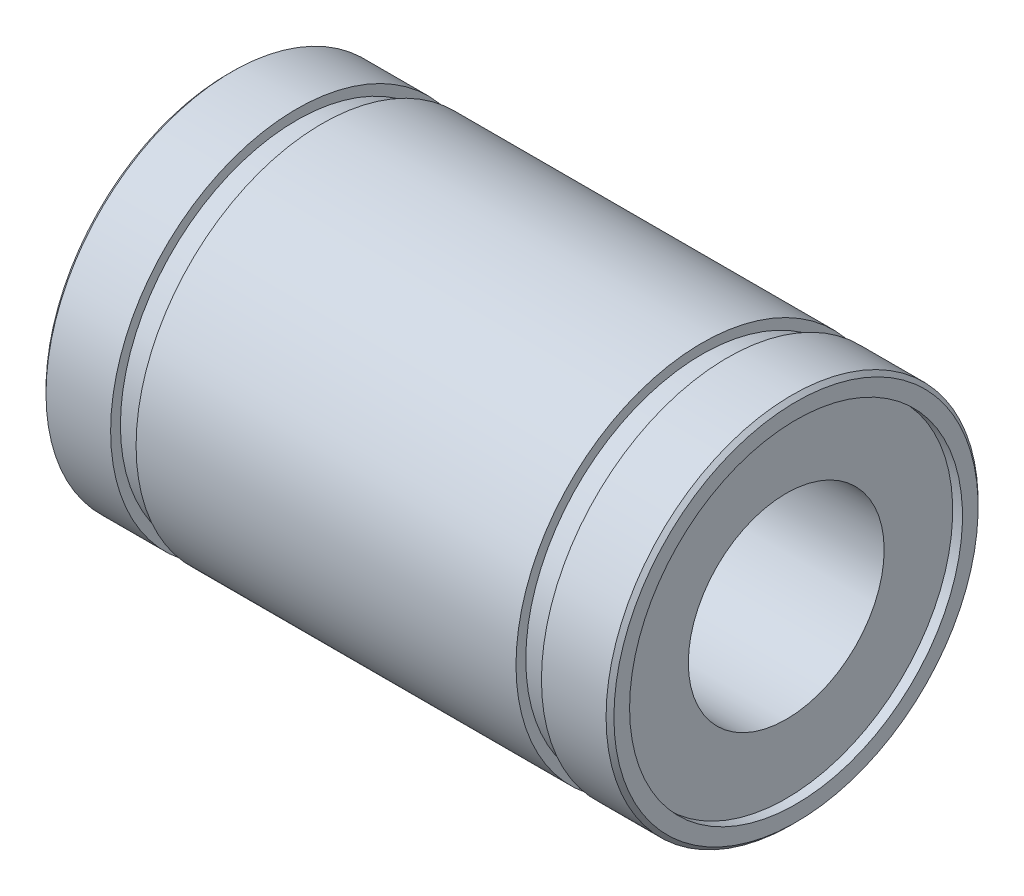
ISO-10303-21;
HEADER;
FILE_DESCRIPTION(('STEP AP214'),'2;1');
FILE_NAME('part.step','',(''),(''),'','','');
FILE_SCHEMA(('AUTOMOTIVE_DESIGN { 1 0 10303 214 1 1 1 1 }'));
ENDSEC;
DATA;
#1=APPLICATION_CONTEXT('core data for automotive mechanical design processes');
#2=APPLICATION_PROTOCOL_DEFINITION('international standard','automotive_design',2000,#1);
#3=PRODUCT_CONTEXT('',#1,'mechanical');
#4=PRODUCT('Part','Part','',(#3));
#5=PRODUCT_RELATED_PRODUCT_CATEGORY('part','',(#4));
#6=PRODUCT_DEFINITION_FORMATION('','',#4);
#7=PRODUCT_DEFINITION_CONTEXT('part definition',#1,'design');
#8=PRODUCT_DEFINITION('design','',#6,#7);
#9=PRODUCT_DEFINITION_SHAPE('','',#8);
#10=(LENGTH_UNIT() NAMED_UNIT(*) SI_UNIT(.MILLI.,.METRE.));
#11=(NAMED_UNIT(*) PLANE_ANGLE_UNIT() SI_UNIT($,.RADIAN.));
#12=(NAMED_UNIT(*) SI_UNIT($,.STERADIAN.) SOLID_ANGLE_UNIT());
#13=UNCERTAINTY_MEASURE_WITH_UNIT(LENGTH_MEASURE(1.E-05),#10,'distance_accuracy_value','');
#14=(GEOMETRIC_REPRESENTATION_CONTEXT(3) GLOBAL_UNCERTAINTY_ASSIGNED_CONTEXT((#13)) GLOBAL_UNIT_ASSIGNED_CONTEXT((#10,
#11,#12)) REPRESENTATION_CONTEXT('',''));
#15=CARTESIAN_POINT('',(0.,0.,0.));
#16=DIRECTION('',(0.,0.,1.));
#17=DIRECTION('',(1.,0.,0.));
#18=AXIS2_PLACEMENT_3D('',#15,#16,#17);
#19=CARTESIAN_POINT('',(0.,0.,0.));
#20=DIRECTION('',(-1.,0.,0.));
#21=DIRECTION('',(0.,0.,1.));
#22=AXIS2_PLACEMENT_3D('',#19,#20,#21);
#23=CYLINDRICAL_SURFACE('',#22,5.);
#24=CARTESIAN_POINT('',(28.5,0.,0.));
#25=DIRECTION('',(-1.,0.,0.));
#26=DIRECTION('',(0.,0.,1.));
#27=AXIS2_PLACEMENT_3D('',#24,#25,#26);
#28=CIRCLE('',#27,5.);
#29=CARTESIAN_POINT('',(28.5,0.,5.));
#30=VERTEX_POINT('',#29);
#31=EDGE_CURVE('E115',#30,#30,#28,.T.);
#32=ORIENTED_EDGE('',*,*,#31,.F.);
#33=EDGE_LOOP('',(#32));
#34=FACE_BOUND('',#33,.T.);
#35=CARTESIAN_POINT('',(0.5,0.,0.));
#36=DIRECTION('',(-1.,0.,0.));
#37=DIRECTION('',(0.,0.,1.));
#38=AXIS2_PLACEMENT_3D('',#35,#36,#37);
#39=CIRCLE('',#38,5.);
#40=CARTESIAN_POINT('',(0.5,0.,5.));
#41=VERTEX_POINT('',#40);
#42=EDGE_CURVE('E67',#41,#41,#39,.T.);
#43=ORIENTED_EDGE('',*,*,#42,.T.);
#44=EDGE_LOOP('',(#43));
#45=FACE_BOUND('',#44,.T.);
#46=ADVANCED_FACE('F38',(#34,#45),#23,.F.);
#47=CARTESIAN_POINT('',(0.5,5.,0.));
#48=DIRECTION('',(1.,0.,0.));
#49=DIRECTION('',(0.,0.,-1.));
#50=AXIS2_PLACEMENT_3D('',#47,#48,#49);
#51=PLANE('',#50);
#52=ORIENTED_EDGE('',*,*,#42,.F.);
#53=EDGE_LOOP('',(#52));
#54=FACE_BOUND('',#53,.T.);
#55=CARTESIAN_POINT('',(0.5,0.,0.));
#56=DIRECTION('',(-1.,0.,0.));
#57=DIRECTION('',(0.,0.,1.));
#58=AXIS2_PLACEMENT_3D('',#55,#56,#57);
#59=CIRCLE('',#58,8.5);
#60=CARTESIAN_POINT('',(0.5,0.,8.5));
#61=VERTEX_POINT('',#60);
#62=EDGE_CURVE('E71',#61,#61,#59,.T.);
#63=ORIENTED_EDGE('',*,*,#62,.T.);
#64=EDGE_LOOP('',(#63));
#65=FACE_BOUND('',#64,.T.);
#66=ADVANCED_FACE('F124',(#54,#65),#51,.F.);
#67=CARTESIAN_POINT('',(0.,0.,0.));
#68=DIRECTION('',(-1.,0.,0.));
#69=DIRECTION('',(0.,0.,1.));
#70=AXIS2_PLACEMENT_3D('',#67,#68,#69);
#71=CYLINDRICAL_SURFACE('',#70,8.5);
#72=ORIENTED_EDGE('',*,*,#62,.F.);
#73=EDGE_LOOP('',(#72));
#74=FACE_BOUND('',#73,.T.);
#75=CARTESIAN_POINT('',(0.,0.,0.));
#76=DIRECTION('',(-1.,0.,0.));
#77=DIRECTION('',(0.,0.,1.));
#78=AXIS2_PLACEMENT_3D('',#75,#76,#77);
#79=CIRCLE('',#78,8.5);
#80=CARTESIAN_POINT('',(0.,0.,8.5));
#81=VERTEX_POINT('',#80);
#82=EDGE_CURVE('E75',#81,#81,#79,.T.);
#83=ORIENTED_EDGE('',*,*,#82,.T.);
#84=EDGE_LOOP('',(#83));
#85=FACE_BOUND('',#84,.T.);
#86=ADVANCED_FACE('F130',(#74,#85),#71,.F.);
#87=CARTESIAN_POINT('',(0.,8.5,0.));
#88=DIRECTION('',(1.,0.,0.));
#89=DIRECTION('',(0.,0.,-1.));
#90=AXIS2_PLACEMENT_3D('',#87,#88,#89);
#91=PLANE('',#90);
#92=CARTESIAN_POINT('',(0.,0.,0.));
#93=DIRECTION('',(1.,0.,0.));
#94=DIRECTION('',(0.,0.,-1.));
#95=AXIS2_PLACEMENT_3D('',#92,#93,#94);
#96=CIRCLE('',#95,9.3);
#97=CARTESIAN_POINT('',(0.,0.,-9.3));
#98=VERTEX_POINT('',#97);
#99=EDGE_CURVE('E47',#98,#98,#96,.F.);
#100=ORIENTED_EDGE('',*,*,#99,.T.);
#101=EDGE_LOOP('',(#100));
#102=FACE_BOUND('',#101,.T.);
#103=ORIENTED_EDGE('',*,*,#82,.F.);
#104=EDGE_LOOP('',(#103));
#105=FACE_BOUND('',#104,.T.);
#106=ADVANCED_FACE('F136',(#102,#105),#91,.F.);
#107=CARTESIAN_POINT('',(0.,0.,0.));
#108=DIRECTION('',(-1.,0.,0.));
#109=DIRECTION('',(0.,0.,1.));
#110=AXIS2_PLACEMENT_3D('',#107,#108,#109);
#111=CYLINDRICAL_SURFACE('',#110,9.5);
#112=CARTESIAN_POINT('',(0.199999999999999,0.,0.));
#113=DIRECTION('',(1.,0.,0.));
#114=DIRECTION('',(0.,0.,-1.));
#115=AXIS2_PLACEMENT_3D('',#112,#113,#114);
#116=CIRCLE('',#115,9.5);
#117=CARTESIAN_POINT('',(0.199999999999999,0.,-9.5));
#118=VERTEX_POINT('',#117);
#119=EDGE_CURVE('E10',#118,#118,#116,.T.);
#120=ORIENTED_EDGE('',*,*,#119,.T.);
#121=EDGE_LOOP('',(#120));
#122=FACE_BOUND('',#121,.T.);
#123=CARTESIAN_POINT('',(3.5,0.,0.));
#124=DIRECTION('',(-1.,0.,0.));
#125=DIRECTION('',(0.,0.,1.));
#126=AXIS2_PLACEMENT_3D('',#123,#124,#125);
#127=CIRCLE('',#126,9.5);
#128=CARTESIAN_POINT('',(3.5,0.,9.5));
#129=VERTEX_POINT('',#128);
#130=EDGE_CURVE('E79',#129,#129,#127,.T.);
#131=ORIENTED_EDGE('',*,*,#130,.T.);
#132=EDGE_LOOP('',(#131));
#133=FACE_BOUND('',#132,.T.);
#134=ADVANCED_FACE('F141',(#122,#133),#111,.T.);
#135=CARTESIAN_POINT('',(3.5,9.5,0.));
#136=DIRECTION('',(-1.,0.,0.));
#137=DIRECTION('',(0.,0.,1.));
#138=AXIS2_PLACEMENT_3D('',#135,#136,#137);
#139=PLANE('',#138);
#140=ORIENTED_EDGE('',*,*,#130,.F.);
#141=EDGE_LOOP('',(#140));
#142=FACE_BOUND('',#141,.T.);
#143=CARTESIAN_POINT('',(3.5,0.,0.));
#144=DIRECTION('',(-1.,0.,0.));
#145=DIRECTION('',(0.,0.,1.));
#146=AXIS2_PLACEMENT_3D('',#143,#144,#145);
#147=CIRCLE('',#146,9.);
#148=CARTESIAN_POINT('',(3.5,0.,9.));
#149=VERTEX_POINT('',#148);
#150=EDGE_CURVE('E83',#149,#149,#147,.T.);
#151=ORIENTED_EDGE('',*,*,#150,.T.);
#152=EDGE_LOOP('',(#151));
#153=FACE_BOUND('',#152,.T.);
#154=ADVANCED_FACE('F146',(#142,#153),#139,.F.);
#155=CARTESIAN_POINT('',(0.,0.,0.));
#156=DIRECTION('',(-1.,0.,0.));
#157=DIRECTION('',(0.,0.,1.));
#158=AXIS2_PLACEMENT_3D('',#155,#156,#157);
#159=CYLINDRICAL_SURFACE('',#158,9.);
#160=ORIENTED_EDGE('',*,*,#150,.F.);
#161=EDGE_LOOP('',(#160));
#162=FACE_BOUND('',#161,.T.);
#163=CARTESIAN_POINT('',(4.8,0.,0.));
#164=DIRECTION('',(-1.,0.,0.));
#165=DIRECTION('',(0.,0.,1.));
#166=AXIS2_PLACEMENT_3D('',#163,#164,#165);
#167=CIRCLE('',#166,9.);
#168=CARTESIAN_POINT('',(4.8,0.,9.));
#169=VERTEX_POINT('',#168);
#170=EDGE_CURVE('E86',#169,#169,#167,.T.);
#171=ORIENTED_EDGE('',*,*,#170,.T.);
#172=EDGE_LOOP('',(#171));
#173=FACE_BOUND('',#172,.T.);
#174=ADVANCED_FACE('F198',(#162,#173),#159,.T.);
#175=CARTESIAN_POINT('',(4.8,9.,0.));
#176=DIRECTION('',(1.,0.,0.));
#177=DIRECTION('',(0.,0.,-1.));
#178=AXIS2_PLACEMENT_3D('',#175,#176,#177);
#179=PLANE('',#178);
#180=ORIENTED_EDGE('',*,*,#170,.F.);
#181=EDGE_LOOP('',(#180));
#182=FACE_BOUND('',#181,.T.);
#183=CARTESIAN_POINT('',(4.8,0.,0.));
#184=DIRECTION('',(-1.,0.,0.));
#185=DIRECTION('',(0.,0.,1.));
#186=AXIS2_PLACEMENT_3D('',#183,#184,#185);
#187=CIRCLE('',#186,9.5);
#188=CARTESIAN_POINT('',(4.8,0.,9.5));
#189=VERTEX_POINT('',#188);
#190=EDGE_CURVE('E89',#189,#189,#187,.T.);
#191=ORIENTED_EDGE('',*,*,#190,.T.);
#192=EDGE_LOOP('',(#191));
#193=FACE_BOUND('',#192,.T.);
#194=ADVANCED_FACE('F194',(#182,#193),#179,.F.);
#195=CARTESIAN_POINT('',(0.,0.,0.));
#196=DIRECTION('',(-1.,0.,0.));
#197=DIRECTION('',(0.,0.,1.));
#198=AXIS2_PLACEMENT_3D('',#195,#196,#197);
#199=CYLINDRICAL_SURFACE('',#198,9.5);
#200=ORIENTED_EDGE('',*,*,#190,.F.);
#201=EDGE_LOOP('',(#200));
#202=FACE_BOUND('',#201,.T.);
#203=CARTESIAN_POINT('',(24.2,0.,0.));
#204=DIRECTION('',(-1.,0.,0.));
#205=DIRECTION('',(0.,0.,1.));
#206=AXIS2_PLACEMENT_3D('',#203,#204,#205);
#207=CIRCLE('',#206,9.5);
#208=CARTESIAN_POINT('',(24.2,0.,9.5));
#209=VERTEX_POINT('',#208);
#210=EDGE_CURVE('E93',#209,#209,#207,.T.);
#211=ORIENTED_EDGE('',*,*,#210,.T.);
#212=EDGE_LOOP('',(#211));
#213=FACE_BOUND('',#212,.T.);
#214=ADVANCED_FACE('F190',(#202,#213),#199,.T.);
#215=CARTESIAN_POINT('',(24.2,9.5,0.));
#216=DIRECTION('',(-1.,0.,0.));
#217=DIRECTION('',(0.,0.,1.));
#218=AXIS2_PLACEMENT_3D('',#215,#216,#217);
#219=PLANE('',#218);
#220=ORIENTED_EDGE('',*,*,#210,.F.);
#221=EDGE_LOOP('',(#220));
#222=FACE_BOUND('',#221,.T.);
#223=CARTESIAN_POINT('',(24.2,0.,0.));
#224=DIRECTION('',(-1.,0.,0.));
#225=DIRECTION('',(0.,0.,1.));
#226=AXIS2_PLACEMENT_3D('',#223,#224,#225);
#227=CIRCLE('',#226,9.);
#228=CARTESIAN_POINT('',(24.2,0.,9.));
#229=VERTEX_POINT('',#228);
#230=EDGE_CURVE('E97',#229,#229,#227,.T.);
#231=ORIENTED_EDGE('',*,*,#230,.T.);
#232=EDGE_LOOP('',(#231));
#233=FACE_BOUND('',#232,.T.);
#234=ADVANCED_FACE('F182',(#222,#233),#219,.F.);
#235=CARTESIAN_POINT('',(0.,0.,0.));
#236=DIRECTION('',(-1.,0.,0.));
#237=DIRECTION('',(0.,0.,1.));
#238=AXIS2_PLACEMENT_3D('',#235,#236,#237);
#239=CYLINDRICAL_SURFACE('',#238,9.);
#240=ORIENTED_EDGE('',*,*,#230,.F.);
#241=EDGE_LOOP('',(#240));
#242=FACE_BOUND('',#241,.T.);
#243=CARTESIAN_POINT('',(25.5,0.,0.));
#244=DIRECTION('',(-1.,0.,0.));
#245=DIRECTION('',(0.,0.,1.));
#246=AXIS2_PLACEMENT_3D('',#243,#244,#245);
#247=CIRCLE('',#246,9.);
#248=CARTESIAN_POINT('',(25.5,0.,9.));
#249=VERTEX_POINT('',#248);
#250=EDGE_CURVE('E100',#249,#249,#247,.T.);
#251=ORIENTED_EDGE('',*,*,#250,.T.);
#252=EDGE_LOOP('',(#251));
#253=FACE_BOUND('',#252,.T.);
#254=ADVANCED_FACE('F176',(#242,#253),#239,.T.);
#255=CARTESIAN_POINT('',(25.5,9.,0.));
#256=DIRECTION('',(1.,0.,0.));
#257=DIRECTION('',(0.,0.,-1.));
#258=AXIS2_PLACEMENT_3D('',#255,#256,#257);
#259=PLANE('',#258);
#260=ORIENTED_EDGE('',*,*,#250,.F.);
#261=EDGE_LOOP('',(#260));
#262=FACE_BOUND('',#261,.T.);
#263=CARTESIAN_POINT('',(25.5,0.,0.));
#264=DIRECTION('',(-1.,0.,0.));
#265=DIRECTION('',(0.,0.,1.));
#266=AXIS2_PLACEMENT_3D('',#263,#264,#265);
#267=CIRCLE('',#266,9.5);
#268=CARTESIAN_POINT('',(25.5,0.,9.5));
#269=VERTEX_POINT('',#268);
#270=EDGE_CURVE('E104',#269,#269,#267,.T.);
#271=ORIENTED_EDGE('',*,*,#270,.T.);
#272=EDGE_LOOP('',(#271));
#273=FACE_BOUND('',#272,.T.);
#274=ADVANCED_FACE('F171',(#262,#273),#259,.F.);
#275=CARTESIAN_POINT('',(0.,0.,0.));
#276=DIRECTION('',(-1.,0.,0.));
#277=DIRECTION('',(0.,0.,1.));
#278=AXIS2_PLACEMENT_3D('',#275,#276,#277);
#279=CYLINDRICAL_SURFACE('',#278,9.5);
#280=CARTESIAN_POINT('',(28.8,0.,0.));
#281=DIRECTION('',(-1.,0.,0.));
#282=DIRECTION('',(0.,0.,1.));
#283=AXIS2_PLACEMENT_3D('',#280,#281,#282);
#284=CIRCLE('',#283,9.5);
#285=CARTESIAN_POINT('',(28.8,0.,9.5));
#286=VERTEX_POINT('',#285);
#287=EDGE_CURVE('E61',#286,#286,#284,.T.);
#288=ORIENTED_EDGE('',*,*,#287,.T.);
#289=EDGE_LOOP('',(#288));
#290=FACE_BOUND('',#289,.T.);
#291=ORIENTED_EDGE('',*,*,#270,.F.);
#292=EDGE_LOOP('',(#291));
#293=FACE_BOUND('',#292,.T.);
#294=ADVANCED_FACE('F167',(#290,#293),#279,.T.);
#295=CARTESIAN_POINT('',(29.,9.5,0.));
#296=DIRECTION('',(-1.,0.,0.));
#297=DIRECTION('',(0.,0.,1.));
#298=AXIS2_PLACEMENT_3D('',#295,#296,#297);
#299=PLANE('',#298);
#300=CARTESIAN_POINT('',(29.,0.,0.));
#301=DIRECTION('',(-1.,0.,0.));
#302=DIRECTION('',(0.,0.,1.));
#303=AXIS2_PLACEMENT_3D('',#300,#301,#302);
#304=CIRCLE('',#303,9.29999999999999);
#305=CARTESIAN_POINT('',(29.,0.,9.29999999999999));
#306=VERTEX_POINT('',#305);
#307=EDGE_CURVE('E54',#306,#306,#304,.F.);
#308=ORIENTED_EDGE('',*,*,#307,.T.);
#309=EDGE_LOOP('',(#308));
#310=FACE_BOUND('',#309,.T.);
#311=CARTESIAN_POINT('',(29.,0.,0.));
#312=DIRECTION('',(-1.,0.,0.));
#313=DIRECTION('',(0.,0.,1.));
#314=AXIS2_PLACEMENT_3D('',#311,#312,#313);
#315=CIRCLE('',#314,8.5);
#316=CARTESIAN_POINT('',(29.,0.,8.5));
#317=VERTEX_POINT('',#316);
#318=EDGE_CURVE('E108',#317,#317,#315,.T.);
#319=ORIENTED_EDGE('',*,*,#318,.T.);
#320=EDGE_LOOP('',(#319));
#321=FACE_BOUND('',#320,.T.);
#322=ADVANCED_FACE('F170',(#310,#321),#299,.F.);
#323=CARTESIAN_POINT('',(0.,0.,0.));
#324=DIRECTION('',(-1.,0.,0.));
#325=DIRECTION('',(0.,0.,1.));
#326=AXIS2_PLACEMENT_3D('',#323,#324,#325);
#327=CYLINDRICAL_SURFACE('',#326,8.5);
#328=ORIENTED_EDGE('',*,*,#318,.F.);
#329=EDGE_LOOP('',(#328));
#330=FACE_BOUND('',#329,.T.);
#331=CARTESIAN_POINT('',(28.5,0.,0.));
#332=DIRECTION('',(-1.,0.,0.));
#333=DIRECTION('',(0.,0.,1.));
#334=AXIS2_PLACEMENT_3D('',#331,#332,#333);
#335=CIRCLE('',#334,8.5);
#336=CARTESIAN_POINT('',(28.5,0.,8.5));
#337=VERTEX_POINT('',#336);
#338=EDGE_CURVE('E111',#337,#337,#335,.T.);
#339=ORIENTED_EDGE('',*,*,#338,.T.);
#340=EDGE_LOOP('',(#339));
#341=FACE_BOUND('',#340,.T.);
#342=ADVANCED_FACE('F160',(#330,#341),#327,.F.);
#343=CARTESIAN_POINT('',(28.5,8.5,0.));
#344=DIRECTION('',(-1.,0.,0.));
#345=DIRECTION('',(0.,0.,1.));
#346=AXIS2_PLACEMENT_3D('',#343,#344,#345);
#347=PLANE('',#346);
#348=ORIENTED_EDGE('',*,*,#338,.F.);
#349=EDGE_LOOP('',(#348));
#350=FACE_BOUND('',#349,.T.);
#351=ORIENTED_EDGE('',*,*,#31,.T.);
#352=EDGE_LOOP('',(#351));
#353=FACE_BOUND('',#352,.T.);
#354=ADVANCED_FACE('F120',(#350,#353),#347,.F.);
#355=CARTESIAN_POINT('',(28.8,0.,0.));
#356=DIRECTION('',(-1.,0.,0.));
#357=DIRECTION('',(0.,0.,1.));
#358=AXIS2_PLACEMENT_3D('',#355,#356,#357);
#359=CONICAL_SURFACE('',#358,9.5,0.785398163397453);
#360=ORIENTED_EDGE('',*,*,#307,.F.);
#361=EDGE_LOOP('',(#360));
#362=FACE_BOUND('',#361,.T.);
#363=ORIENTED_EDGE('',*,*,#287,.F.);
#364=EDGE_LOOP('',(#363));
#365=FACE_BOUND('',#364,.T.);
#366=ADVANCED_FACE('F150',(#362,#365),#359,.T.);
#367=CARTESIAN_POINT('',(0.,0.,0.));
#368=DIRECTION('',(1.,0.,0.));
#369=DIRECTION('',(0.,0.,-1.));
#370=AXIS2_PLACEMENT_3D('',#367,#368,#369);
#371=CONICAL_SURFACE('',#370,9.3,0.785398163397461);
#372=ORIENTED_EDGE('',*,*,#119,.F.);
#373=EDGE_LOOP('',(#372));
#374=FACE_BOUND('',#373,.T.);
#375=ORIENTED_EDGE('',*,*,#99,.F.);
#376=EDGE_LOOP('',(#375));
#377=FACE_BOUND('',#376,.T.);
#378=ADVANCED_FACE('F41',(#374,#377),#371,.T.);
#379=CLOSED_SHELL('',(#46,#66,#86,#106,#134,#154,#174,#194,#214,#234,#254,#274,#294,#322,#342,
#354,#366,#378));
#380=MANIFOLD_SOLID_BREP('B2',#379);
#381=ADVANCED_BREP_SHAPE_REPRESENTATION('',(#18,#380),#14);
#382=SHAPE_DEFINITION_REPRESENTATION(#9,#381);
ENDSEC;
END-ISO-10303-21;
